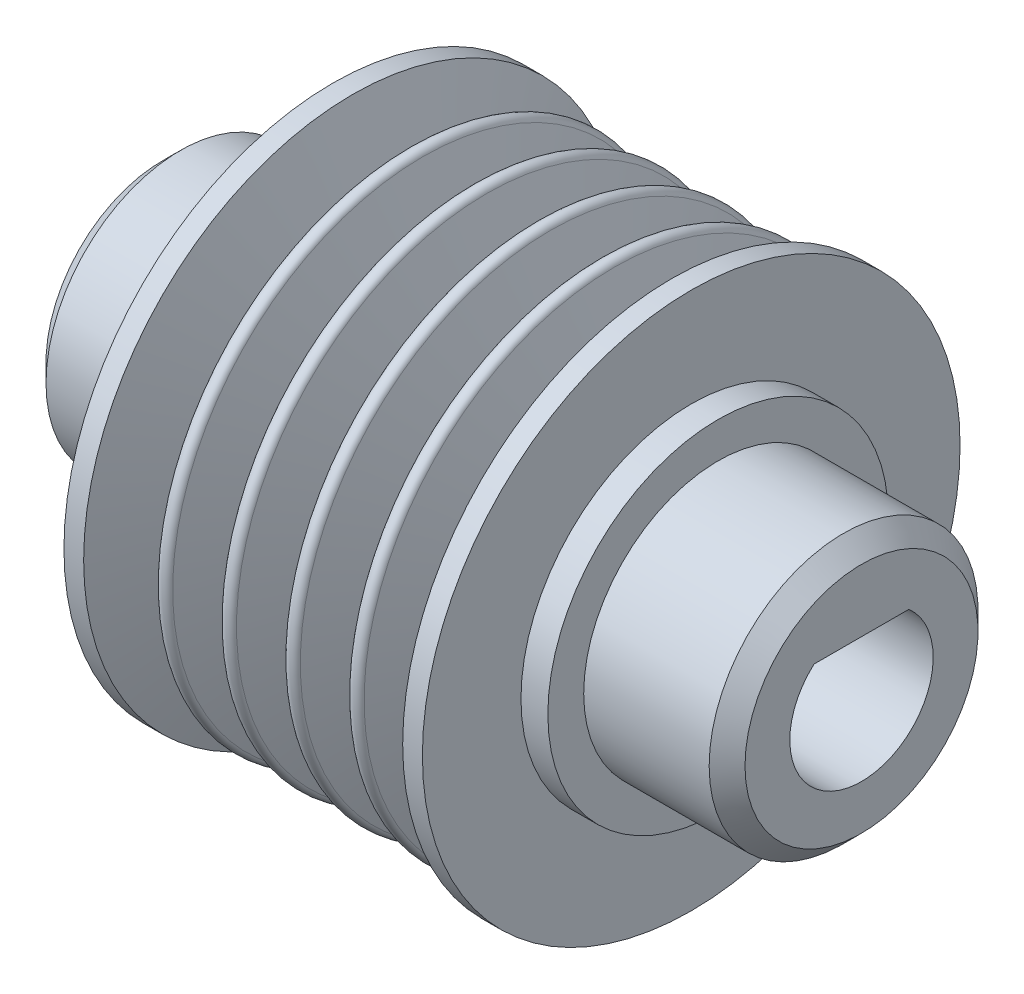
ISO-10303-21;
HEADER;
FILE_DESCRIPTION(('STEP AP214'),'2;1');
FILE_NAME('part.step','',(''),(''),'','','');
FILE_SCHEMA(('AUTOMOTIVE_DESIGN { 1 0 10303 214 1 1 1 1 }'));
ENDSEC;
DATA;
#1=APPLICATION_CONTEXT('core data for automotive mechanical design processes');
#2=APPLICATION_PROTOCOL_DEFINITION('international standard','automotive_design',2000,#1);
#3=PRODUCT_CONTEXT('',#1,'mechanical');
#4=PRODUCT('Part','Part','',(#3));
#5=PRODUCT_RELATED_PRODUCT_CATEGORY('part','',(#4));
#6=PRODUCT_DEFINITION_FORMATION('','',#4);
#7=PRODUCT_DEFINITION_CONTEXT('part definition',#1,'design');
#8=PRODUCT_DEFINITION('design','',#6,#7);
#9=PRODUCT_DEFINITION_SHAPE('','',#8);
#10=(LENGTH_UNIT() NAMED_UNIT(*) SI_UNIT(.MILLI.,.METRE.));
#11=(NAMED_UNIT(*) PLANE_ANGLE_UNIT() SI_UNIT($,.RADIAN.));
#12=(NAMED_UNIT(*) SI_UNIT($,.STERADIAN.) SOLID_ANGLE_UNIT());
#13=UNCERTAINTY_MEASURE_WITH_UNIT(LENGTH_MEASURE(1.E-05),#10,'distance_accuracy_value','');
#14=(GEOMETRIC_REPRESENTATION_CONTEXT(3) GLOBAL_UNCERTAINTY_ASSIGNED_CONTEXT((#13)) GLOBAL_UNIT_ASSIGNED_CONTEXT((#10,
#11,#12)) REPRESENTATION_CONTEXT('',''));
#15=CARTESIAN_POINT('',(0.,0.,0.));
#16=DIRECTION('',(0.,0.,1.));
#17=DIRECTION('',(1.,0.,0.));
#18=AXIS2_PLACEMENT_3D('',#15,#16,#17);
#19=CARTESIAN_POINT('',(0.,0.,0.));
#20=DIRECTION('',(-1.,0.,0.));
#21=DIRECTION('',(0.,-1.,0.));
#22=AXIS2_PLACEMENT_3D('',#19,#20,#21);
#23=CONICAL_SURFACE('',#22,10.1094901933707,1.22173047639603);
#24=CARTESIAN_POINT('',(-0.375877048314367,0.,0.));
#25=DIRECTION('',(-1.,0.,0.));
#26=DIRECTION('',(0.,-1.,0.));
#27=AXIS2_PLACEMENT_3D('',#24,#25,#26);
#28=CIRCLE('',#27,11.1422038961057);
#29=CARTESIAN_POINT('',(-0.375877048314365,-11.1422038961057,0.));
#30=VERTEX_POINT('',#29);
#31=EDGE_CURVE('E205',#30,#30,#28,.T.);
#32=ORIENTED_EDGE('',*,*,#31,.T.);
#33=EDGE_LOOP('',(#32));
#34=FACE_BOUND('',#33,.T.);
#35=CARTESIAN_POINT('',(-1.40412295168565,0.,0.));
#36=DIRECTION('',(1.,0.,0.));
#37=DIRECTION('',(0.,1.,0.));
#38=AXIS2_PLACEMENT_3D('',#35,#36,#37);
#39=CIRCLE('',#38,13.967286297265);
#40=CARTESIAN_POINT('',(-1.40412295168565,13.967286297265,0.));
#41=VERTEX_POINT('',#40);
#42=EDGE_CURVE('E153',#41,#41,#39,.T.);
#43=ORIENTED_EDGE('',*,*,#42,.T.);
#44=EDGE_LOOP('',(#43));
#45=FACE_BOUND('',#44,.T.);
#46=ADVANCED_FACE('F49',(#34,#45),#23,.T.);
#47=CARTESIAN_POINT('',(1.77999999999999,0.,0.));
#48=DIRECTION('',(1.,0.,0.));
#49=DIRECTION('',(0.,1.,0.));
#50=AXIS2_PLACEMENT_3D('',#47,#48,#49);
#51=CONICAL_SURFACE('',#50,15.,1.22173047639604);
#52=CARTESIAN_POINT('',(0.375877048314363,0.,0.));
#53=DIRECTION('',(1.,0.,0.));
#54=DIRECTION('',(0.,1.,0.));
#55=AXIS2_PLACEMENT_3D('',#52,#53,#54);
#56=CIRCLE('',#55,11.1422038961057);
#57=CARTESIAN_POINT('',(0.375877048314362,11.1422038961057,0.));
#58=VERTEX_POINT('',#57);
#59=EDGE_CURVE('E201',#58,#58,#56,.T.);
#60=ORIENTED_EDGE('',*,*,#59,.T.);
#61=EDGE_LOOP('',(#60));
#62=FACE_BOUND('',#61,.T.);
#63=CARTESIAN_POINT('',(1.40412295168563,0.,0.));
#64=DIRECTION('',(-1.,0.,0.));
#65=DIRECTION('',(0.,-1.,0.));
#66=AXIS2_PLACEMENT_3D('',#63,#64,#65);
#67=CIRCLE('',#66,13.967286297265);
#68=CARTESIAN_POINT('',(1.40412295168563,-13.967286297265,0.));
#69=VERTEX_POINT('',#68);
#70=EDGE_CURVE('E149',#69,#69,#67,.T.);
#71=ORIENTED_EDGE('',*,*,#70,.T.);
#72=EDGE_LOOP('',(#71));
#73=FACE_BOUND('',#72,.T.);
#74=ADVANCED_FACE('F233',(#62,#73),#51,.T.);
#75=CARTESIAN_POINT('',(-3.56,0.,0.));
#76=DIRECTION('',(-1.,0.,0.));
#77=DIRECTION('',(0.,-1.,0.));
#78=AXIS2_PLACEMENT_3D('',#75,#76,#77);
#79=CONICAL_SURFACE('',#78,10.1094901933707,1.22173047639603);
#80=CARTESIAN_POINT('',(-3.93587704831437,0.,0.));
#81=DIRECTION('',(-1.,0.,0.));
#82=DIRECTION('',(0.,-1.,0.));
#83=AXIS2_PLACEMENT_3D('',#80,#81,#82);
#84=CIRCLE('',#83,11.1422038961057);
#85=CARTESIAN_POINT('',(-3.93587704831437,-11.1422038961057,0.));
#86=VERTEX_POINT('',#85);
#87=EDGE_CURVE('E213',#86,#86,#84,.T.);
#88=ORIENTED_EDGE('',*,*,#87,.T.);
#89=EDGE_LOOP('',(#88));
#90=FACE_BOUND('',#89,.T.);
#91=CARTESIAN_POINT('',(-4.96412295168564,0.,0.));
#92=DIRECTION('',(1.,0.,0.));
#93=DIRECTION('',(0.,1.,0.));
#94=AXIS2_PLACEMENT_3D('',#91,#92,#93);
#95=CIRCLE('',#94,13.967286297265);
#96=CARTESIAN_POINT('',(-4.96412295168564,13.967286297265,0.));
#97=VERTEX_POINT('',#96);
#98=EDGE_CURVE('E161',#97,#97,#95,.T.);
#99=ORIENTED_EDGE('',*,*,#98,.T.);
#100=EDGE_LOOP('',(#99));
#101=FACE_BOUND('',#100,.T.);
#102=ADVANCED_FACE('F240',(#90,#101),#79,.T.);
#103=CARTESIAN_POINT('',(-1.78000000000001,0.,0.));
#104=DIRECTION('',(1.,0.,0.));
#105=DIRECTION('',(0.,1.,0.));
#106=AXIS2_PLACEMENT_3D('',#103,#104,#105);
#107=CONICAL_SURFACE('',#106,15.,1.22173047639603);
#108=CARTESIAN_POINT('',(-3.18412295168564,0.,0.));
#109=DIRECTION('',(1.,0.,0.));
#110=DIRECTION('',(0.,1.,0.));
#111=AXIS2_PLACEMENT_3D('',#108,#109,#110);
#112=CIRCLE('',#111,11.1422038961057);
#113=CARTESIAN_POINT('',(-3.18412295168564,11.1422038961057,0.));
#114=VERTEX_POINT('',#113);
#115=EDGE_CURVE('E209',#114,#114,#112,.T.);
#116=ORIENTED_EDGE('',*,*,#115,.T.);
#117=EDGE_LOOP('',(#116));
#118=FACE_BOUND('',#117,.T.);
#119=CARTESIAN_POINT('',(-2.15587704831437,0.,0.));
#120=DIRECTION('',(-1.,0.,0.));
#121=DIRECTION('',(0.,-1.,0.));
#122=AXIS2_PLACEMENT_3D('',#119,#120,#121);
#123=CIRCLE('',#122,13.967286297265);
#124=CARTESIAN_POINT('',(-2.15587704831437,-13.967286297265,0.));
#125=VERTEX_POINT('',#124);
#126=EDGE_CURVE('E157',#125,#125,#123,.T.);
#127=ORIENTED_EDGE('',*,*,#126,.T.);
#128=EDGE_LOOP('',(#127));
#129=FACE_BOUND('',#128,.T.);
#130=ADVANCED_FACE('F271',(#118,#129),#107,.T.);
#131=CARTESIAN_POINT('',(-19.5,7.5,0.));
#132=DIRECTION('',(1.,0.,0.));
#133=DIRECTION('',(0.,0.,-1.));
#134=AXIS2_PLACEMENT_3D('',#131,#132,#133);
#135=PLANE('',#134);
#136=CARTESIAN_POINT('',(-19.5,0.,0.));
#137=DIRECTION('',(1.,0.,0.));
#138=DIRECTION('',(0.,0.,-1.));
#139=AXIS2_PLACEMENT_3D('',#136,#137,#138);
#140=CIRCLE('',#139,6.5);
#141=CARTESIAN_POINT('',(-19.5,0.,-6.5));
#142=VERTEX_POINT('',#141);
#143=EDGE_CURVE('E177',#142,#142,#140,.F.);
#144=ORIENTED_EDGE('',*,*,#143,.T.);
#145=EDGE_LOOP('',(#144));
#146=FACE_BOUND('',#145,.T.);
#147=CARTESIAN_POINT('',(-19.5,0.,0.));
#148=DIRECTION('',(1.,0.,0.));
#149=DIRECTION('',(0.,0.,-1.));
#150=AXIS2_PLACEMENT_3D('',#147,#148,#149);
#151=CIRCLE('',#150,4.);
#152=CARTESIAN_POINT('',(-19.5,3.,2.64575131106459));
#153=VERTEX_POINT('',#152);
#154=CARTESIAN_POINT('',(-19.5,3.,-2.64575131106459));
#155=VERTEX_POINT('',#154);
#156=EDGE_CURVE('E70',#153,#155,#151,.T.);
#157=ORIENTED_EDGE('',*,*,#156,.T.);
#158=DIRECTION('',(0.,0.,1.));
#159=VECTOR('',#158,1.);
#160=CARTESIAN_POINT('',(-19.5,3.,-2.64575131106459));
#161=LINE('',#160,#159);
#162=EDGE_CURVE('E616',#155,#153,#161,.T.);
#163=ORIENTED_EDGE('',*,*,#162,.T.);
#164=EDGE_LOOP('',(#157,#163));
#165=FACE_BOUND('',#164,.T.);
#166=ADVANCED_FACE('F267',(#146,#165),#135,.F.);
#167=CARTESIAN_POINT('',(0.,0.,0.));
#168=DIRECTION('',(-1.,0.,0.));
#169=DIRECTION('',(0.,0.,1.));
#170=AXIS2_PLACEMENT_3D('',#167,#168,#169);
#171=CYLINDRICAL_SURFACE('',#170,7.5);
#172=CARTESIAN_POINT('',(-18.5,0.,0.));
#173=DIRECTION('',(1.,0.,0.));
#174=DIRECTION('',(0.,0.,-1.));
#175=AXIS2_PLACEMENT_3D('',#172,#173,#174);
#176=CIRCLE('',#175,7.5);
#177=CARTESIAN_POINT('',(-18.5,0.,-7.5));
#178=VERTEX_POINT('',#177);
#179=EDGE_CURVE('E181',#178,#178,#176,.T.);
#180=ORIENTED_EDGE('',*,*,#179,.T.);
#181=EDGE_LOOP('',(#180));
#182=FACE_BOUND('',#181,.T.);
#183=CARTESIAN_POINT('',(-11.5,0.,0.));
#184=DIRECTION('',(-1.,0.,0.));
#185=DIRECTION('',(0.,0.,1.));
#186=AXIS2_PLACEMENT_3D('',#183,#184,#185);
#187=CIRCLE('',#186,7.5);
#188=CARTESIAN_POINT('',(-11.5,0.,7.5));
#189=VERTEX_POINT('',#188);
#190=EDGE_CURVE('E115',#189,#189,#187,.T.);
#191=ORIENTED_EDGE('',*,*,#190,.T.);
#192=EDGE_LOOP('',(#191));
#193=FACE_BOUND('',#192,.T.);
#194=ADVANCED_FACE('F263',(#182,#193),#171,.T.);
#195=CARTESIAN_POINT('',(-11.5,7.5,0.));
#196=DIRECTION('',(1.,0.,0.));
#197=DIRECTION('',(0.,0.,-1.));
#198=AXIS2_PLACEMENT_3D('',#195,#196,#197);
#199=PLANE('',#198);
#200=ORIENTED_EDGE('',*,*,#190,.F.);
#201=EDGE_LOOP('',(#200));
#202=FACE_BOUND('',#201,.T.);
#203=CARTESIAN_POINT('',(-11.5,0.,0.));
#204=DIRECTION('',(-1.,0.,0.));
#205=DIRECTION('',(0.,0.,1.));
#206=AXIS2_PLACEMENT_3D('',#203,#204,#205);
#207=CIRCLE('',#206,9.5);
#208=CARTESIAN_POINT('',(-11.5,0.,9.5));
#209=VERTEX_POINT('',#208);
#210=EDGE_CURVE('E102',#209,#209,#207,.T.);
#211=ORIENTED_EDGE('',*,*,#210,.T.);
#212=EDGE_LOOP('',(#211));
#213=FACE_BOUND('',#212,.T.);
#214=ADVANCED_FACE('F259',(#202,#213),#199,.F.);
#215=CARTESIAN_POINT('',(0.,0.,0.));
#216=DIRECTION('',(-1.,0.,0.));
#217=DIRECTION('',(0.,0.,1.));
#218=AXIS2_PLACEMENT_3D('',#215,#216,#217);
#219=CYLINDRICAL_SURFACE('',#218,9.5);
#220=ORIENTED_EDGE('',*,*,#210,.F.);
#221=EDGE_LOOP('',(#220));
#222=FACE_BOUND('',#221,.T.);
#223=CARTESIAN_POINT('',(-10.,0.,0.));
#224=DIRECTION('',(-1.,0.,0.));
#225=DIRECTION('',(0.,0.,1.));
#226=AXIS2_PLACEMENT_3D('',#223,#224,#225);
#227=CIRCLE('',#226,9.5);
#228=CARTESIAN_POINT('',(-10.,0.,9.5));
#229=VERTEX_POINT('',#228);
#230=EDGE_CURVE('E106',#229,#229,#227,.T.);
#231=ORIENTED_EDGE('',*,*,#230,.T.);
#232=EDGE_LOOP('',(#231));
#233=FACE_BOUND('',#232,.T.);
#234=ADVANCED_FACE('F255',(#222,#233),#219,.T.);
#235=CARTESIAN_POINT('',(-10.,15.,0.));
#236=DIRECTION('',(1.,0.,0.));
#237=DIRECTION('',(0.,0.,-1.));
#238=AXIS2_PLACEMENT_3D('',#235,#236,#237);
#239=PLANE('',#238);
#240=ORIENTED_EDGE('',*,*,#230,.F.);
#241=EDGE_LOOP('',(#240));
#242=FACE_BOUND('',#241,.T.);
#243=CARTESIAN_POINT('',(-10.,0.,0.));
#244=DIRECTION('',(-1.,0.,0.));
#245=DIRECTION('',(0.,0.,1.));
#246=AXIS2_PLACEMENT_3D('',#243,#244,#245);
#247=CIRCLE('',#246,15.);
#248=CARTESIAN_POINT('',(-10.,0.,15.));
#249=VERTEX_POINT('',#248);
#250=EDGE_CURVE('E111',#249,#249,#247,.T.);
#251=ORIENTED_EDGE('',*,*,#250,.T.);
#252=EDGE_LOOP('',(#251));
#253=FACE_BOUND('',#252,.T.);
#254=ADVANCED_FACE('F258',(#242,#253),#239,.F.);
#255=CARTESIAN_POINT('',(-17.2155539368274,0.,0.));
#256=DIRECTION('',(-1.,0.,0.));
#257=DIRECTION('',(0.,0.,1.));
#258=AXIS2_PLACEMENT_3D('',#255,#256,#257);
#259=CYLINDRICAL_SURFACE('',#258,15.);
#260=ORIENTED_EDGE('',*,*,#250,.F.);
#261=EDGE_LOOP('',(#260));
#262=FACE_BOUND('',#261,.T.);
#263=CARTESIAN_POINT('',(-8.9,0.,0.));
#264=DIRECTION('',(1.,0.,0.));
#265=DIRECTION('',(0.,1.,0.));
#266=AXIS2_PLACEMENT_3D('',#263,#264,#265);
#267=CIRCLE('',#266,15.);
#268=CARTESIAN_POINT('',(-8.90000000000001,15.,0.));
#269=VERTEX_POINT('',#268);
#270=EDGE_CURVE('E98',#269,#269,#267,.T.);
#271=ORIENTED_EDGE('',*,*,#270,.F.);
#272=EDGE_LOOP('',(#271));
#273=FACE_BOUND('',#272,.T.);
#274=ADVANCED_FACE('F293',(#262,#273),#259,.T.);
#275=CARTESIAN_POINT('',(-7.12,0.,0.));
#276=DIRECTION('',(-1.,0.,0.));
#277=DIRECTION('',(0.,-1.,0.));
#278=AXIS2_PLACEMENT_3D('',#275,#276,#277);
#279=CONICAL_SURFACE('',#278,10.1094901933707,1.22173047639603);
#280=CARTESIAN_POINT('',(-7.49587704831436,0.,0.));
#281=DIRECTION('',(-1.,0.,0.));
#282=DIRECTION('',(0.,-1.,0.));
#283=AXIS2_PLACEMENT_3D('',#280,#281,#282);
#284=CIRCLE('',#283,11.1422038961057);
#285=CARTESIAN_POINT('',(-7.49587704831436,-11.1422038961057,0.));
#286=VERTEX_POINT('',#285);
#287=EDGE_CURVE('E11',#286,#286,#284,.T.);
#288=ORIENTED_EDGE('',*,*,#287,.T.);
#289=EDGE_LOOP('',(#288));
#290=FACE_BOUND('',#289,.T.);
#291=ORIENTED_EDGE('',*,*,#270,.T.);
#292=EDGE_LOOP('',(#291));
#293=FACE_BOUND('',#292,.T.);
#294=ADVANCED_FACE('F296',(#290,#293),#279,.T.);
#295=CARTESIAN_POINT('',(-5.34000000000001,0.,0.));
#296=DIRECTION('',(1.,0.,0.));
#297=DIRECTION('',(0.,1.,0.));
#298=AXIS2_PLACEMENT_3D('',#295,#296,#297);
#299=CONICAL_SURFACE('',#298,15.,1.22173047639603);
#300=CARTESIAN_POINT('',(-6.74412295168565,0.,0.));
#301=DIRECTION('',(1.,0.,0.));
#302=DIRECTION('',(0.,1.,0.));
#303=AXIS2_PLACEMENT_3D('',#300,#301,#302);
#304=CIRCLE('',#303,11.1422038961057);
#305=CARTESIAN_POINT('',(-6.74412295168565,11.1422038961057,0.));
#306=VERTEX_POINT('',#305);
#307=EDGE_CURVE('E58',#306,#306,#304,.T.);
#308=ORIENTED_EDGE('',*,*,#307,.T.);
#309=EDGE_LOOP('',(#308));
#310=FACE_BOUND('',#309,.T.);
#311=CARTESIAN_POINT('',(-5.71587704831437,0.,0.));
#312=DIRECTION('',(-1.,0.,0.));
#313=DIRECTION('',(0.,-1.,0.));
#314=AXIS2_PLACEMENT_3D('',#311,#312,#313);
#315=CIRCLE('',#314,13.967286297265);
#316=CARTESIAN_POINT('',(-5.71587704831437,-13.967286297265,0.));
#317=VERTEX_POINT('',#316);
#318=EDGE_CURVE('E165',#317,#317,#315,.T.);
#319=ORIENTED_EDGE('',*,*,#318,.T.);
#320=EDGE_LOOP('',(#319));
#321=FACE_BOUND('',#320,.T.);
#322=ADVANCED_FACE('F220',(#310,#321),#299,.T.);
#323=CARTESIAN_POINT('',(3.55999999999999,0.,0.));
#324=DIRECTION('',(-1.,0.,0.));
#325=DIRECTION('',(0.,-1.,0.));
#326=AXIS2_PLACEMENT_3D('',#323,#324,#325);
#327=CONICAL_SURFACE('',#326,10.1094901933707,1.22173047639603);
#328=CARTESIAN_POINT('',(3.18412295168563,0.,0.));
#329=DIRECTION('',(-1.,0.,0.));
#330=DIRECTION('',(0.,-1.,0.));
#331=AXIS2_PLACEMENT_3D('',#328,#329,#330);
#332=CIRCLE('',#331,11.1422038961057);
#333=CARTESIAN_POINT('',(3.18412295168563,-11.1422038961057,0.));
#334=VERTEX_POINT('',#333);
#335=EDGE_CURVE('E197',#334,#334,#332,.T.);
#336=ORIENTED_EDGE('',*,*,#335,.T.);
#337=EDGE_LOOP('',(#336));
#338=FACE_BOUND('',#337,.T.);
#339=CARTESIAN_POINT('',(2.15587704831435,0.,0.));
#340=DIRECTION('',(1.,0.,0.));
#341=DIRECTION('',(0.,1.,0.));
#342=AXIS2_PLACEMENT_3D('',#339,#340,#341);
#343=CIRCLE('',#342,13.967286297265);
#344=CARTESIAN_POINT('',(2.15587704831435,13.967286297265,0.));
#345=VERTEX_POINT('',#344);
#346=EDGE_CURVE('E145',#345,#345,#343,.T.);
#347=ORIENTED_EDGE('',*,*,#346,.T.);
#348=EDGE_LOOP('',(#347));
#349=FACE_BOUND('',#348,.T.);
#350=ADVANCED_FACE('F350',(#338,#349),#327,.T.);
#351=CARTESIAN_POINT('',(5.33999999999999,0.,0.));
#352=DIRECTION('',(1.,0.,0.));
#353=DIRECTION('',(0.,1.,0.));
#354=AXIS2_PLACEMENT_3D('',#351,#352,#353);
#355=CONICAL_SURFACE('',#354,15.,1.22173047639603);
#356=CARTESIAN_POINT('',(3.93587704831434,0.,0.));
#357=DIRECTION('',(1.,0.,0.));
#358=DIRECTION('',(0.,1.,0.));
#359=AXIS2_PLACEMENT_3D('',#356,#357,#358);
#360=CIRCLE('',#359,11.1422038961057);
#361=CARTESIAN_POINT('',(3.93587704831434,11.1422038961057,0.));
#362=VERTEX_POINT('',#361);
#363=EDGE_CURVE('E193',#362,#362,#360,.T.);
#364=ORIENTED_EDGE('',*,*,#363,.T.);
#365=EDGE_LOOP('',(#364));
#366=FACE_BOUND('',#365,.T.);
#367=CARTESIAN_POINT('',(4.96412295168563,0.,0.));
#368=DIRECTION('',(-1.,0.,0.));
#369=DIRECTION('',(0.,-1.,0.));
#370=AXIS2_PLACEMENT_3D('',#367,#368,#369);
#371=CIRCLE('',#370,13.967286297265);
#372=CARTESIAN_POINT('',(4.96412295168563,-13.967286297265,0.));
#373=VERTEX_POINT('',#372);
#374=EDGE_CURVE('E141',#373,#373,#371,.T.);
#375=ORIENTED_EDGE('',*,*,#374,.T.);
#376=EDGE_LOOP('',(#375));
#377=FACE_BOUND('',#376,.T.);
#378=ADVANCED_FACE('F280',(#366,#377),#355,.T.);
#379=CARTESIAN_POINT('',(19.5,7.5,0.));
#380=DIRECTION('',(-1.,0.,0.));
#381=DIRECTION('',(0.,0.,1.));
#382=AXIS2_PLACEMENT_3D('',#379,#380,#381);
#383=PLANE('',#382);
#384=CARTESIAN_POINT('',(19.5,0.,0.));
#385=DIRECTION('',(-1.,0.,0.));
#386=DIRECTION('',(0.,0.,1.));
#387=AXIS2_PLACEMENT_3D('',#384,#385,#386);
#388=CIRCLE('',#387,6.49999999999999);
#389=CARTESIAN_POINT('',(19.5,0.,6.49999999999999));
#390=VERTEX_POINT('',#389);
#391=EDGE_CURVE('E173',#390,#390,#388,.F.);
#392=ORIENTED_EDGE('',*,*,#391,.T.);
#393=EDGE_LOOP('',(#392));
#394=FACE_BOUND('',#393,.T.);
#395=CARTESIAN_POINT('',(19.5,0.,0.));
#396=DIRECTION('',(1.,0.,0.));
#397=DIRECTION('',(0.,0.,-1.));
#398=AXIS2_PLACEMENT_3D('',#395,#396,#397);
#399=CIRCLE('',#398,4.);
#400=CARTESIAN_POINT('',(19.5,3.,2.64575131106459));
#401=VERTEX_POINT('',#400);
#402=CARTESIAN_POINT('',(19.5,3.,-2.64575131106459));
#403=VERTEX_POINT('',#402);
#404=EDGE_CURVE('E65',#401,#403,#399,.T.);
#405=ORIENTED_EDGE('',*,*,#404,.F.);
#406=DIRECTION('',(0.,0.,-1.));
#407=VECTOR('',#406,1.);
#408=CARTESIAN_POINT('',(19.5,3.,-2.64575131106459));
#409=LINE('',#408,#407);
#410=EDGE_CURVE('E78',#401,#403,#409,.T.);
#411=ORIENTED_EDGE('',*,*,#410,.T.);
#412=EDGE_LOOP('',(#405,#411));
#413=FACE_BOUND('',#412,.T.);
#414=ADVANCED_FACE('F76',(#394,#413),#383,.F.);
#415=CARTESIAN_POINT('',(0.,0.,0.));
#416=DIRECTION('',(-1.,0.,0.));
#417=DIRECTION('',(0.,0.,1.));
#418=AXIS2_PLACEMENT_3D('',#415,#416,#417);
#419=CYLINDRICAL_SURFACE('',#418,7.5);
#420=CARTESIAN_POINT('',(18.5,0.,0.));
#421=DIRECTION('',(-1.,0.,0.));
#422=DIRECTION('',(0.,0.,1.));
#423=AXIS2_PLACEMENT_3D('',#420,#421,#422);
#424=CIRCLE('',#423,7.5);
#425=CARTESIAN_POINT('',(18.5,0.,7.5));
#426=VERTEX_POINT('',#425);
#427=EDGE_CURVE('E169',#426,#426,#424,.T.);
#428=ORIENTED_EDGE('',*,*,#427,.T.);
#429=EDGE_LOOP('',(#428));
#430=FACE_BOUND('',#429,.T.);
#431=CARTESIAN_POINT('',(11.5,0.,0.));
#432=DIRECTION('',(-1.,0.,0.));
#433=DIRECTION('',(0.,0.,1.));
#434=AXIS2_PLACEMENT_3D('',#431,#432,#433);
#435=CIRCLE('',#434,7.5);
#436=CARTESIAN_POINT('',(11.5,0.,7.5));
#437=VERTEX_POINT('',#436);
#438=EDGE_CURVE('E119',#437,#437,#435,.T.);
#439=ORIENTED_EDGE('',*,*,#438,.F.);
#440=EDGE_LOOP('',(#439));
#441=FACE_BOUND('',#440,.T.);
#442=ADVANCED_FACE('F273',(#430,#441),#419,.T.);
#443=CARTESIAN_POINT('',(11.5,7.5,0.));
#444=DIRECTION('',(-1.,0.,0.));
#445=DIRECTION('',(0.,0.,1.));
#446=AXIS2_PLACEMENT_3D('',#443,#444,#445);
#447=PLANE('',#446);
#448=CARTESIAN_POINT('',(11.5,0.,0.));
#449=DIRECTION('',(-1.,0.,0.));
#450=DIRECTION('',(0.,0.,1.));
#451=AXIS2_PLACEMENT_3D('',#448,#449,#450);
#452=CIRCLE('',#451,9.5);
#453=CARTESIAN_POINT('',(11.5,0.,9.5));
#454=VERTEX_POINT('',#453);
#455=EDGE_CURVE('E127',#454,#454,#452,.T.);
#456=ORIENTED_EDGE('',*,*,#455,.F.);
#457=EDGE_LOOP('',(#456));
#458=FACE_BOUND('',#457,.T.);
#459=ORIENTED_EDGE('',*,*,#438,.T.);
#460=EDGE_LOOP('',(#459));
#461=FACE_BOUND('',#460,.T.);
#462=ADVANCED_FACE('F276',(#458,#461),#447,.F.);
#463=CARTESIAN_POINT('',(0.,0.,0.));
#464=DIRECTION('',(-1.,0.,0.));
#465=DIRECTION('',(0.,0.,1.));
#466=AXIS2_PLACEMENT_3D('',#463,#464,#465);
#467=CYLINDRICAL_SURFACE('',#466,9.5);
#468=CARTESIAN_POINT('',(10.,0.,0.));
#469=DIRECTION('',(-1.,0.,0.));
#470=DIRECTION('',(0.,0.,1.));
#471=AXIS2_PLACEMENT_3D('',#468,#469,#470);
#472=CIRCLE('',#471,9.5);
#473=CARTESIAN_POINT('',(10.,0.,9.5));
#474=VERTEX_POINT('',#473);
#475=EDGE_CURVE('E123',#474,#474,#472,.T.);
#476=ORIENTED_EDGE('',*,*,#475,.F.);
#477=EDGE_LOOP('',(#476));
#478=FACE_BOUND('',#477,.T.);
#479=ORIENTED_EDGE('',*,*,#455,.T.);
#480=EDGE_LOOP('',(#479));
#481=FACE_BOUND('',#480,.T.);
#482=ADVANCED_FACE('F282',(#478,#481),#467,.T.);
#483=CARTESIAN_POINT('',(10.,15.,0.));
#484=DIRECTION('',(-1.,0.,0.));
#485=DIRECTION('',(0.,0.,1.));
#486=AXIS2_PLACEMENT_3D('',#483,#484,#485);
#487=PLANE('',#486);
#488=ORIENTED_EDGE('',*,*,#475,.T.);
#489=EDGE_LOOP('',(#488));
#490=FACE_BOUND('',#489,.T.);
#491=CARTESIAN_POINT('',(10.,0.,0.));
#492=DIRECTION('',(-1.,0.,0.));
#493=DIRECTION('',(0.,0.,1.));
#494=AXIS2_PLACEMENT_3D('',#491,#492,#493);
#495=CIRCLE('',#494,15.);
#496=CARTESIAN_POINT('',(10.,0.,15.));
#497=VERTEX_POINT('',#496);
#498=EDGE_CURVE('E131',#497,#497,#495,.T.);
#499=ORIENTED_EDGE('',*,*,#498,.F.);
#500=EDGE_LOOP('',(#499));
#501=FACE_BOUND('',#500,.T.);
#502=ADVANCED_FACE('F285',(#490,#501),#487,.F.);
#503=ORIENTED_EDGE('',*,*,#498,.T.);
#504=EDGE_LOOP('',(#503));
#505=FACE_BOUND('',#504,.T.);
#506=CARTESIAN_POINT('',(8.89999999999999,0.,0.));
#507=DIRECTION('',(1.,0.,0.));
#508=DIRECTION('',(0.,1.,0.));
#509=AXIS2_PLACEMENT_3D('',#506,#507,#508);
#510=CIRCLE('',#509,15.);
#511=CARTESIAN_POINT('',(8.89999999999999,15.,0.));
#512=VERTEX_POINT('',#511);
#513=EDGE_CURVE('E97',#512,#512,#510,.T.);
#514=ORIENTED_EDGE('',*,*,#513,.T.);
#515=EDGE_LOOP('',(#514));
#516=FACE_BOUND('',#515,.T.);
#517=ADVANCED_FACE('F250',(#505,#516),#259,.T.);
#518=CARTESIAN_POINT('',(8.89999999999999,0.,0.));
#519=DIRECTION('',(1.,0.,0.));
#520=DIRECTION('',(0.,1.,0.));
#521=AXIS2_PLACEMENT_3D('',#518,#519,#520);
#522=CONICAL_SURFACE('',#521,15.,1.22173047639603);
#523=CARTESIAN_POINT('',(7.49587704831434,0.,0.));
#524=DIRECTION('',(1.,0.,0.));
#525=DIRECTION('',(0.,1.,0.));
#526=AXIS2_PLACEMENT_3D('',#523,#524,#525);
#527=CIRCLE('',#526,11.1422038961057);
#528=CARTESIAN_POINT('',(7.49587704831434,11.1422038961057,0.));
#529=VERTEX_POINT('',#528);
#530=EDGE_CURVE('E185',#529,#529,#527,.T.);
#531=ORIENTED_EDGE('',*,*,#530,.T.);
#532=EDGE_LOOP('',(#531));
#533=FACE_BOUND('',#532,.T.);
#534=ORIENTED_EDGE('',*,*,#513,.F.);
#535=EDGE_LOOP('',(#534));
#536=FACE_BOUND('',#535,.T.);
#537=ADVANCED_FACE('F246',(#533,#536),#522,.T.);
#538=CARTESIAN_POINT('',(7.11999999999999,0.,0.));
#539=DIRECTION('',(-1.,0.,0.));
#540=DIRECTION('',(0.,-1.,0.));
#541=AXIS2_PLACEMENT_3D('',#538,#539,#540);
#542=CONICAL_SURFACE('',#541,10.1094901933707,1.22173047639603);
#543=CARTESIAN_POINT('',(6.74412295168562,0.,0.));
#544=DIRECTION('',(-1.,0.,0.));
#545=DIRECTION('',(0.,-1.,0.));
#546=AXIS2_PLACEMENT_3D('',#543,#544,#545);
#547=CIRCLE('',#546,11.1422038961057);
#548=CARTESIAN_POINT('',(6.74412295168562,-11.1422038961057,0.));
#549=VERTEX_POINT('',#548);
#550=EDGE_CURVE('E189',#549,#549,#547,.T.);
#551=ORIENTED_EDGE('',*,*,#550,.T.);
#552=EDGE_LOOP('',(#551));
#553=FACE_BOUND('',#552,.T.);
#554=CARTESIAN_POINT('',(5.71587704831435,0.,0.));
#555=DIRECTION('',(1.,0.,0.));
#556=DIRECTION('',(0.,1.,0.));
#557=AXIS2_PLACEMENT_3D('',#554,#555,#556);
#558=CIRCLE('',#557,13.967286297265);
#559=CARTESIAN_POINT('',(5.71587704831435,13.967286297265,0.));
#560=VERTEX_POINT('',#559);
#561=EDGE_CURVE('E110',#560,#560,#558,.T.);
#562=ORIENTED_EDGE('',*,*,#561,.T.);
#563=EDGE_LOOP('',(#562));
#564=FACE_BOUND('',#563,.T.);
#565=ADVANCED_FACE('F249',(#553,#564),#542,.T.);
#566=CARTESIAN_POINT('',(-19.5,0.,0.));
#567=DIRECTION('',(1.,0.,0.));
#568=DIRECTION('',(0.,0.,-1.));
#569=AXIS2_PLACEMENT_3D('',#566,#567,#568);
#570=CYLINDRICAL_SURFACE('',#569,4.);
#571=ORIENTED_EDGE('',*,*,#404,.T.);
#572=DIRECTION('',(-1.,0.,0.));
#573=VECTOR('',#572,1.);
#574=CARTESIAN_POINT('',(24.8851648071345,3.,-2.64575131106459));
#575=LINE('',#574,#573);
#576=EDGE_CURVE('E88',#403,#155,#575,.T.);
#577=ORIENTED_EDGE('',*,*,#576,.T.);
#578=ORIENTED_EDGE('',*,*,#156,.F.);
#579=DIRECTION('',(-1.,0.,0.));
#580=VECTOR('',#579,1.);
#581=CARTESIAN_POINT('',(24.8851648071345,3.,2.64575131106459));
#582=LINE('',#581,#580);
#583=EDGE_CURVE('E82',#401,#153,#582,.T.);
#584=ORIENTED_EDGE('',*,*,#583,.F.);
#585=EDGE_LOOP('',(#571,#577,#578,#584));
#586=FACE_BOUND('',#585,.T.);
#587=ADVANCED_FACE('F83',(#586),#570,.F.);
#588=CARTESIAN_POINT('',(24.8851648071345,3.,-2.64575131106459));
#589=DIRECTION('',(0.,-1.,0.));
#590=DIRECTION('',(0.,0.,-1.));
#591=AXIS2_PLACEMENT_3D('',#588,#589,#590);
#592=PLANE('',#591);
#593=ORIENTED_EDGE('',*,*,#410,.F.);
#594=ORIENTED_EDGE('',*,*,#583,.T.);
#595=ORIENTED_EDGE('',*,*,#162,.F.);
#596=ORIENTED_EDGE('',*,*,#576,.F.);
#597=EDGE_LOOP('',(#593,#594,#595,#596));
#598=FACE_BOUND('',#597,.T.);
#599=ADVANCED_FACE('F90',(#598),#592,.T.);
#600=CARTESIAN_POINT('',(5.33999999999999,0.,0.));
#601=DIRECTION('',(-1.,0.,0.));
#602=DIRECTION('',(0.,-1.,0.));
#603=AXIS2_PLACEMENT_3D('',#600,#601,#602);
#604=TOROIDAL_SURFACE('',#603,13.8304782399348,0.4);
#605=ORIENTED_EDGE('',*,*,#374,.F.);
#606=EDGE_LOOP('',(#605));
#607=FACE_BOUND('',#606,.T.);
#608=ORIENTED_EDGE('',*,*,#561,.F.);
#609=EDGE_LOOP('',(#608));
#610=FACE_BOUND('',#609,.T.);
#611=ADVANCED_FACE('F301',(#607,#610),#604,.T.);
#612=CARTESIAN_POINT('',(1.77999999999999,0.,0.));
#613=DIRECTION('',(-1.,0.,0.));
#614=DIRECTION('',(0.,-1.,0.));
#615=AXIS2_PLACEMENT_3D('',#612,#613,#614);
#616=TOROIDAL_SURFACE('',#615,13.8304782399348,0.4);
#617=ORIENTED_EDGE('',*,*,#70,.F.);
#618=EDGE_LOOP('',(#617));
#619=FACE_BOUND('',#618,.T.);
#620=ORIENTED_EDGE('',*,*,#346,.F.);
#621=EDGE_LOOP('',(#620));
#622=FACE_BOUND('',#621,.T.);
#623=ADVANCED_FACE('F304',(#619,#622),#616,.T.);
#624=CARTESIAN_POINT('',(-1.78000000000001,0.,0.));
#625=DIRECTION('',(-1.,0.,0.));
#626=DIRECTION('',(0.,-1.,0.));
#627=AXIS2_PLACEMENT_3D('',#624,#625,#626);
#628=TOROIDAL_SURFACE('',#627,13.8304782399348,0.4);
#629=ORIENTED_EDGE('',*,*,#126,.F.);
#630=EDGE_LOOP('',(#629));
#631=FACE_BOUND('',#630,.T.);
#632=ORIENTED_EDGE('',*,*,#42,.F.);
#633=EDGE_LOOP('',(#632));
#634=FACE_BOUND('',#633,.T.);
#635=ADVANCED_FACE('F308',(#631,#634),#628,.T.);
#636=CARTESIAN_POINT('',(-5.34000000000001,0.,0.));
#637=DIRECTION('',(-1.,0.,0.));
#638=DIRECTION('',(0.,-1.,0.));
#639=AXIS2_PLACEMENT_3D('',#636,#637,#638);
#640=TOROIDAL_SURFACE('',#639,13.8304782399348,0.4);
#641=ORIENTED_EDGE('',*,*,#318,.F.);
#642=EDGE_LOOP('',(#641));
#643=FACE_BOUND('',#642,.T.);
#644=ORIENTED_EDGE('',*,*,#98,.F.);
#645=EDGE_LOOP('',(#644));
#646=FACE_BOUND('',#645,.T.);
#647=ADVANCED_FACE('F312',(#643,#646),#640,.T.);
#648=CARTESIAN_POINT('',(18.5,0.,0.));
#649=DIRECTION('',(-1.,0.,0.));
#650=DIRECTION('',(0.,0.,1.));
#651=AXIS2_PLACEMENT_3D('',#648,#649,#650);
#652=CONICAL_SURFACE('',#651,7.5,0.785398163397451);
#653=ORIENTED_EDGE('',*,*,#391,.F.);
#654=EDGE_LOOP('',(#653));
#655=FACE_BOUND('',#654,.T.);
#656=ORIENTED_EDGE('',*,*,#427,.F.);
#657=EDGE_LOOP('',(#656));
#658=FACE_BOUND('',#657,.T.);
#659=ADVANCED_FACE('F316',(#655,#658),#652,.T.);
#660=CARTESIAN_POINT('',(-19.5,0.,0.));
#661=DIRECTION('',(1.,0.,0.));
#662=DIRECTION('',(0.,0.,-1.));
#663=AXIS2_PLACEMENT_3D('',#660,#661,#662);
#664=CONICAL_SURFACE('',#663,6.5,0.785398163397447);
#665=ORIENTED_EDGE('',*,*,#179,.F.);
#666=EDGE_LOOP('',(#665));
#667=FACE_BOUND('',#666,.T.);
#668=ORIENTED_EDGE('',*,*,#143,.F.);
#669=EDGE_LOOP('',(#668));
#670=FACE_BOUND('',#669,.T.);
#671=ADVANCED_FACE('F324',(#667,#670),#664,.T.);
#672=CARTESIAN_POINT('',(7.11999999999999,0.,0.));
#673=DIRECTION('',(1.,0.,0.));
#674=DIRECTION('',(0.,1.,0.));
#675=AXIS2_PLACEMENT_3D('',#672,#673,#674);
#676=TOROIDAL_SURFACE('',#675,11.279011953436,0.4);
#677=ORIENTED_EDGE('',*,*,#550,.F.);
#678=EDGE_LOOP('',(#677));
#679=FACE_BOUND('',#678,.T.);
#680=ORIENTED_EDGE('',*,*,#530,.F.);
#681=EDGE_LOOP('',(#680));
#682=FACE_BOUND('',#681,.T.);
#683=ADVANCED_FACE('F329',(#679,#682),#676,.F.);
#684=CARTESIAN_POINT('',(3.55999999999999,0.,0.));
#685=DIRECTION('',(1.,0.,0.));
#686=DIRECTION('',(0.,1.,0.));
#687=AXIS2_PLACEMENT_3D('',#684,#685,#686);
#688=TOROIDAL_SURFACE('',#687,11.279011953436,0.4);
#689=ORIENTED_EDGE('',*,*,#335,.F.);
#690=EDGE_LOOP('',(#689));
#691=FACE_BOUND('',#690,.T.);
#692=ORIENTED_EDGE('',*,*,#363,.F.);
#693=EDGE_LOOP('',(#692));
#694=FACE_BOUND('',#693,.T.);
#695=ADVANCED_FACE('F333',(#691,#694),#688,.F.);
#696=CARTESIAN_POINT('',(0.,0.,0.));
#697=DIRECTION('',(1.,0.,0.));
#698=DIRECTION('',(0.,1.,0.));
#699=AXIS2_PLACEMENT_3D('',#696,#697,#698);
#700=TOROIDAL_SURFACE('',#699,11.279011953436,0.4);
#701=ORIENTED_EDGE('',*,*,#31,.F.);
#702=EDGE_LOOP('',(#701));
#703=FACE_BOUND('',#702,.T.);
#704=ORIENTED_EDGE('',*,*,#59,.F.);
#705=EDGE_LOOP('',(#704));
#706=FACE_BOUND('',#705,.T.);
#707=ADVANCED_FACE('F229',(#703,#706),#700,.F.);
#708=CARTESIAN_POINT('',(-3.56000000000001,0.,0.));
#709=DIRECTION('',(1.,0.,0.));
#710=DIRECTION('',(0.,1.,0.));
#711=AXIS2_PLACEMENT_3D('',#708,#709,#710);
#712=TOROIDAL_SURFACE('',#711,11.279011953436,0.4);
#713=ORIENTED_EDGE('',*,*,#87,.F.);
#714=EDGE_LOOP('',(#713));
#715=FACE_BOUND('',#714,.T.);
#716=ORIENTED_EDGE('',*,*,#115,.F.);
#717=EDGE_LOOP('',(#716));
#718=FACE_BOUND('',#717,.T.);
#719=ADVANCED_FACE('F224',(#715,#718),#712,.F.);
#720=CARTESIAN_POINT('',(-7.12,0.,0.));
#721=DIRECTION('',(1.,0.,0.));
#722=DIRECTION('',(0.,1.,0.));
#723=AXIS2_PLACEMENT_3D('',#720,#721,#722);
#724=TOROIDAL_SURFACE('',#723,11.279011953436,0.4);
#725=ORIENTED_EDGE('',*,*,#287,.F.);
#726=EDGE_LOOP('',(#725));
#727=FACE_BOUND('',#726,.T.);
#728=ORIENTED_EDGE('',*,*,#307,.F.);
#729=EDGE_LOOP('',(#728));
#730=FACE_BOUND('',#729,.T.);
#731=ADVANCED_FACE('F51',(#727,#730),#724,.F.);
#732=CLOSED_SHELL('',(#46,#74,#102,#130,#166,#194,#214,#234,#254,#274,#294,#322,#350,#378,#414,
#442,#462,#482,#502,#517,#537,#565,#587,#599,#611,#623,#635,#647,#659,#671,#683,#695,#707,#719,#731));
#733=MANIFOLD_SOLID_BREP('B2',#732);
#734=ADVANCED_BREP_SHAPE_REPRESENTATION('',(#18,#733),#14);
#735=SHAPE_DEFINITION_REPRESENTATION(#9,#734);
ENDSEC;
END-ISO-10303-21;
